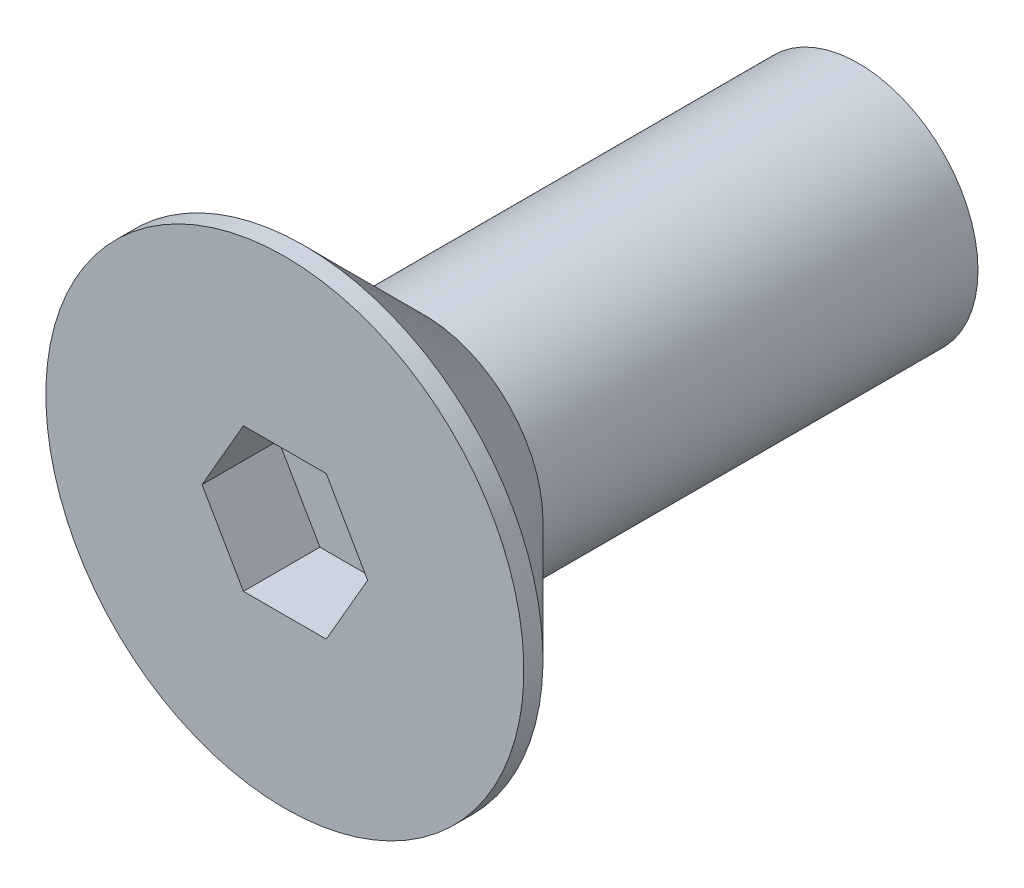
ISO-10303-21;
HEADER;
FILE_DESCRIPTION(('STEP AP214'),'2;1');
FILE_NAME('part.step','',(''),(''),'','','');
FILE_SCHEMA(('AUTOMOTIVE_DESIGN { 1 0 10303 214 1 1 1 1 }'));
ENDSEC;
DATA;
#1=APPLICATION_CONTEXT('core data for automotive mechanical design processes');
#2=APPLICATION_PROTOCOL_DEFINITION('international standard','automotive_design',2000,#1);
#3=PRODUCT_CONTEXT('',#1,'mechanical');
#4=PRODUCT('Part','Part','',(#3));
#5=PRODUCT_RELATED_PRODUCT_CATEGORY('part','',(#4));
#6=PRODUCT_DEFINITION_FORMATION('','',#4);
#7=PRODUCT_DEFINITION_CONTEXT('part definition',#1,'design');
#8=PRODUCT_DEFINITION('design','',#6,#7);
#9=PRODUCT_DEFINITION_SHAPE('','',#8);
#10=(LENGTH_UNIT() NAMED_UNIT(*) SI_UNIT(.MILLI.,.METRE.));
#11=(NAMED_UNIT(*) PLANE_ANGLE_UNIT() SI_UNIT($,.RADIAN.));
#12=(NAMED_UNIT(*) SI_UNIT($,.STERADIAN.) SOLID_ANGLE_UNIT());
#13=UNCERTAINTY_MEASURE_WITH_UNIT(LENGTH_MEASURE(1.E-05),#10,'distance_accuracy_value','');
#14=(GEOMETRIC_REPRESENTATION_CONTEXT(3) GLOBAL_UNCERTAINTY_ASSIGNED_CONTEXT((#13)) GLOBAL_UNIT_ASSIGNED_CONTEXT((#10,
#11,#12)) REPRESENTATION_CONTEXT('',''));
#15=CARTESIAN_POINT('',(0.,0.,0.));
#16=DIRECTION('',(0.,0.,1.));
#17=DIRECTION('',(1.,0.,0.));
#18=AXIS2_PLACEMENT_3D('',#15,#16,#17);
#19=CARTESIAN_POINT('',(-0.90932659804821,-0.787499942816793,-0.8));
#20=DIRECTION('',(0.,0.,-1.));
#21=DIRECTION('',(-1.,0.,0.));
#22=AXIS2_PLACEMENT_3D('',#19,#20,#21);
#23=PLANE('',#22);
#24=DIRECTION('',(-0.5,0.866025403784438,0.));
#25=VECTOR('',#24,1.);
#26=CARTESIAN_POINT('',(0.433012701892218,0.750000000000004,-0.8));
#27=LINE('',#26,#25);
#28=CARTESIAN_POINT('',(0.866025403784438,0.,-0.8));
#29=VERTEX_POINT('',#28);
#30=CARTESIAN_POINT('',(0.433012701892218,0.750000000000004,-0.8));
#31=VERTEX_POINT('',#30);
#32=EDGE_CURVE('E121',#29,#31,#27,.T.);
#33=ORIENTED_EDGE('',*,*,#32,.T.);
#34=DIRECTION('',(-1.,0.,0.));
#35=VECTOR('',#34,1.);
#36=CARTESIAN_POINT('',(-0.433012701892219,0.750000000000004,-0.8));
#37=LINE('',#36,#35);
#38=CARTESIAN_POINT('',(-0.433012701892219,0.750000000000004,-0.8));
#39=VERTEX_POINT('',#38);
#40=EDGE_CURVE('E126',#31,#39,#37,.T.);
#41=ORIENTED_EDGE('',*,*,#40,.T.);
#42=DIRECTION('',(-0.500000000000001,-0.866025403784438,0.));
#43=VECTOR('',#42,1.);
#44=CARTESIAN_POINT('',(-0.866025403784439,0.,-0.8));
#45=LINE('',#44,#43);
#46=CARTESIAN_POINT('',(-0.866025403784439,0.,-0.8));
#47=VERTEX_POINT('',#46);
#48=EDGE_CURVE('E130',#39,#47,#45,.T.);
#49=ORIENTED_EDGE('',*,*,#48,.T.);
#50=DIRECTION('',(0.500000000000001,-0.866025403784438,0.));
#51=VECTOR('',#50,1.);
#52=CARTESIAN_POINT('',(-0.43301270189222,-0.749999999999996,-0.8));
#53=LINE('',#52,#51);
#54=CARTESIAN_POINT('',(-0.43301270189222,-0.749999999999996,-0.8));
#55=VERTEX_POINT('',#54);
#56=EDGE_CURVE('E67',#47,#55,#53,.T.);
#57=ORIENTED_EDGE('',*,*,#56,.T.);
#58=DIRECTION('',(1.,0.,0.));
#59=VECTOR('',#58,1.);
#60=CARTESIAN_POINT('',(0.43301270189222,-0.749999999999996,-0.8));
#61=LINE('',#60,#59);
#62=CARTESIAN_POINT('',(0.43301270189222,-0.749999999999996,-0.8));
#63=VERTEX_POINT('',#62);
#64=EDGE_CURVE('E69',#55,#63,#61,.T.);
#65=ORIENTED_EDGE('',*,*,#64,.T.);
#66=DIRECTION('',(0.499999999999999,0.866025403784439,0.));
#67=VECTOR('',#66,1.);
#68=CARTESIAN_POINT('',(0.866025403784438,0.,-0.8));
#69=LINE('',#68,#67);
#70=EDGE_CURVE('E71',#63,#29,#69,.T.);
#71=ORIENTED_EDGE('',*,*,#70,.T.);
#72=EDGE_LOOP('',(#33,#41,#49,#57,#65,#71));
#73=FACE_BOUND('',#72,.T.);
#74=ADVANCED_FACE('F16',(#73),#23,.F.);
#75=CARTESIAN_POINT('',(0.866025403784438,0.,0.));
#76=DIRECTION('',(0.866025403784439,-0.499999999999999,0.));
#77=DIRECTION('',(0.499999999999999,0.866025403784439,0.));
#78=AXIS2_PLACEMENT_3D('',#75,#76,#77);
#79=PLANE('',#78);
#80=ORIENTED_EDGE('',*,*,#70,.F.);
#81=DIRECTION('',(0.,0.,1.));
#82=VECTOR('',#81,1.);
#83=CARTESIAN_POINT('',(0.43301270189222,-0.749999999999996,0.));
#84=LINE('',#83,#82);
#85=CARTESIAN_POINT('',(0.43301270189222,-0.749999999999996,0.));
#86=VERTEX_POINT('',#85);
#87=EDGE_CURVE('E76',#63,#86,#84,.T.);
#88=ORIENTED_EDGE('',*,*,#87,.T.);
#89=DIRECTION('',(-0.499999999999999,-0.866025403784439,0.));
#90=VECTOR('',#89,1.);
#91=CARTESIAN_POINT('',(0.866025403784438,0.,0.));
#92=LINE('',#91,#90);
#93=CARTESIAN_POINT('',(0.866025403784438,0.,0.));
#94=VERTEX_POINT('',#93);
#95=EDGE_CURVE('E118',#94,#86,#92,.T.);
#96=ORIENTED_EDGE('',*,*,#95,.F.);
#97=DIRECTION('',(0.,0.,1.));
#98=VECTOR('',#97,1.);
#99=CARTESIAN_POINT('',(0.866025403784438,0.,0.));
#100=LINE('',#99,#98);
#101=EDGE_CURVE('E82',#94,#29,#100,.F.);
#102=ORIENTED_EDGE('',*,*,#101,.T.);
#103=EDGE_LOOP('',(#80,#88,#96,#102));
#104=FACE_BOUND('',#103,.T.);
#105=ADVANCED_FACE('F79',(#104),#79,.F.);
#106=CARTESIAN_POINT('',(0.43301270189222,-0.749999999999996,0.));
#107=DIRECTION('',(0.,-1.,0.));
#108=DIRECTION('',(1.,0.,0.));
#109=AXIS2_PLACEMENT_3D('',#106,#107,#108);
#110=PLANE('',#109);
#111=ORIENTED_EDGE('',*,*,#64,.F.);
#112=DIRECTION('',(0.,0.,1.));
#113=VECTOR('',#112,1.);
#114=CARTESIAN_POINT('',(-0.43301270189222,-0.749999999999996,0.));
#115=LINE('',#114,#113);
#116=CARTESIAN_POINT('',(-0.43301270189222,-0.749999999999996,0.));
#117=VERTEX_POINT('',#116);
#118=EDGE_CURVE('E90',#55,#117,#115,.T.);
#119=ORIENTED_EDGE('',*,*,#118,.T.);
#120=DIRECTION('',(1.,0.,0.));
#121=VECTOR('',#120,1.);
#122=CARTESIAN_POINT('',(2.75,-0.749999999999996,0.));
#123=LINE('',#122,#121);
#124=EDGE_CURVE('E87',#86,#117,#123,.F.);
#125=ORIENTED_EDGE('',*,*,#124,.F.);
#126=ORIENTED_EDGE('',*,*,#87,.F.);
#127=EDGE_LOOP('',(#111,#119,#125,#126));
#128=FACE_BOUND('',#127,.T.);
#129=ADVANCED_FACE('F85',(#128),#110,.F.);
#130=CARTESIAN_POINT('',(-0.43301270189222,-0.749999999999996,0.));
#131=DIRECTION('',(-0.866025403784438,-0.500000000000001,0.));
#132=DIRECTION('',(0.500000000000001,-0.866025403784438,0.));
#133=AXIS2_PLACEMENT_3D('',#130,#131,#132);
#134=PLANE('',#133);
#135=ORIENTED_EDGE('',*,*,#56,.F.);
#136=DIRECTION('',(0.,0.,1.));
#137=VECTOR('',#136,1.);
#138=CARTESIAN_POINT('',(-0.866025403784439,0.,0.));
#139=LINE('',#138,#137);
#140=CARTESIAN_POINT('',(-0.866025403784439,0.,0.));
#141=VERTEX_POINT('',#140);
#142=EDGE_CURVE('E128',#47,#141,#139,.T.);
#143=ORIENTED_EDGE('',*,*,#142,.T.);
#144=DIRECTION('',(-0.5,0.866025403784438,0.));
#145=VECTOR('',#144,1.);
#146=CARTESIAN_POINT('',(-0.43301270189222,-0.749999999999996,0.));
#147=LINE('',#146,#145);
#148=EDGE_CURVE('E114',#117,#141,#147,.T.);
#149=ORIENTED_EDGE('',*,*,#148,.F.);
#150=ORIENTED_EDGE('',*,*,#118,.F.);
#151=EDGE_LOOP('',(#135,#143,#149,#150));
#152=FACE_BOUND('',#151,.T.);
#153=ADVANCED_FACE('F133',(#152),#134,.F.);
#154=CARTESIAN_POINT('',(-0.866025403784439,0.,0.));
#155=DIRECTION('',(-0.866025403784438,0.500000000000001,0.));
#156=DIRECTION('',(-0.500000000000001,-0.866025403784438,0.));
#157=AXIS2_PLACEMENT_3D('',#154,#155,#156);
#158=PLANE('',#157);
#159=ORIENTED_EDGE('',*,*,#48,.F.);
#160=DIRECTION('',(0.,0.,1.));
#161=VECTOR('',#160,1.);
#162=CARTESIAN_POINT('',(-0.433012701892219,0.750000000000004,0.));
#163=LINE('',#162,#161);
#164=CARTESIAN_POINT('',(-0.433012701892219,0.750000000000004,0.));
#165=VERTEX_POINT('',#164);
#166=EDGE_CURVE('E124',#39,#165,#163,.T.);
#167=ORIENTED_EDGE('',*,*,#166,.T.);
#168=DIRECTION('',(0.5,0.866025403784439,0.));
#169=VECTOR('',#168,1.);
#170=CARTESIAN_POINT('',(-0.866025403784439,0.,0.));
#171=LINE('',#170,#169);
#172=EDGE_CURVE('E111',#141,#165,#171,.T.);
#173=ORIENTED_EDGE('',*,*,#172,.F.);
#174=ORIENTED_EDGE('',*,*,#142,.F.);
#175=EDGE_LOOP('',(#159,#167,#173,#174));
#176=FACE_BOUND('',#175,.T.);
#177=ADVANCED_FACE('F144',(#176),#158,.F.);
#178=CARTESIAN_POINT('',(-0.433012701892219,0.750000000000004,0.));
#179=DIRECTION('',(0.,1.,0.));
#180=DIRECTION('',(-1.,0.,0.));
#181=AXIS2_PLACEMENT_3D('',#178,#179,#180);
#182=PLANE('',#181);
#183=ORIENTED_EDGE('',*,*,#40,.F.);
#184=DIRECTION('',(0.,0.,1.));
#185=VECTOR('',#184,1.);
#186=CARTESIAN_POINT('',(0.433012701892218,0.750000000000004,0.));
#187=LINE('',#186,#185);
#188=CARTESIAN_POINT('',(0.433012701892218,0.750000000000004,0.));
#189=VERTEX_POINT('',#188);
#190=EDGE_CURVE('E34',#31,#189,#187,.T.);
#191=ORIENTED_EDGE('',*,*,#190,.T.);
#192=DIRECTION('',(1.,0.,0.));
#193=VECTOR('',#192,1.);
#194=CARTESIAN_POINT('',(2.75,0.750000000000004,0.));
#195=LINE('',#194,#193);
#196=EDGE_CURVE('E108',#165,#189,#195,.T.);
#197=ORIENTED_EDGE('',*,*,#196,.F.);
#198=ORIENTED_EDGE('',*,*,#166,.F.);
#199=EDGE_LOOP('',(#183,#191,#197,#198));
#200=FACE_BOUND('',#199,.T.);
#201=ADVANCED_FACE('F142',(#200),#182,.F.);
#202=CARTESIAN_POINT('',(0.433012701892218,0.750000000000004,0.));
#203=DIRECTION('',(0.866025403784438,0.5,0.));
#204=DIRECTION('',(-0.5,0.866025403784438,0.));
#205=AXIS2_PLACEMENT_3D('',#202,#203,#204);
#206=PLANE('',#205);
#207=ORIENTED_EDGE('',*,*,#32,.F.);
#208=ORIENTED_EDGE('',*,*,#101,.F.);
#209=DIRECTION('',(0.500000000000001,-0.866025403784438,0.));
#210=VECTOR('',#209,1.);
#211=CARTESIAN_POINT('',(0.433012701892218,0.750000000000004,0.));
#212=LINE('',#211,#210);
#213=EDGE_CURVE('E102',#189,#94,#212,.T.);
#214=ORIENTED_EDGE('',*,*,#213,.F.);
#215=ORIENTED_EDGE('',*,*,#190,.F.);
#216=EDGE_LOOP('',(#207,#208,#214,#215));
#217=FACE_BOUND('',#216,.T.);
#218=ADVANCED_FACE('F139',(#217),#206,.F.);
#219=CARTESIAN_POINT('',(2.75,-2.75,0.));
#220=DIRECTION('',(0.,0.,1.));
#221=DIRECTION('',(1.,0.,0.));
#222=AXIS2_PLACEMENT_3D('',#219,#220,#221);
#223=PLANE('',#222);
#224=CARTESIAN_POINT('',(0.,0.,0.));
#225=DIRECTION('',(0.,0.,-1.));
#226=DIRECTION('',(0.,1.,0.));
#227=AXIS2_PLACEMENT_3D('',#224,#225,#226);
#228=CIRCLE('',#227,2.5);
#229=CARTESIAN_POINT('',(0.,2.5,0.));
#230=VERTEX_POINT('',#229);
#231=EDGE_CURVE('E19',#230,#230,#228,.T.);
#232=ORIENTED_EDGE('',*,*,#231,.F.);
#233=EDGE_LOOP('',(#232));
#234=FACE_BOUND('',#233,.T.);
#235=ORIENTED_EDGE('',*,*,#196,.T.);
#236=ORIENTED_EDGE('',*,*,#213,.T.);
#237=ORIENTED_EDGE('',*,*,#95,.T.);
#238=ORIENTED_EDGE('',*,*,#124,.T.);
#239=ORIENTED_EDGE('',*,*,#148,.T.);
#240=ORIENTED_EDGE('',*,*,#172,.T.);
#241=EDGE_LOOP('',(#235,#236,#237,#238,#239,#240));
#242=FACE_BOUND('',#241,.T.);
#243=ADVANCED_FACE('F137',(#234,#242),#223,.T.);
#244=CARTESIAN_POINT('',(0.,0.,0.));
#245=DIRECTION('',(0.,0.,-1.));
#246=DIRECTION('',(0.,1.,0.));
#247=AXIS2_PLACEMENT_3D('',#244,#245,#246);
#248=CYLINDRICAL_SURFACE('',#247,2.5);
#249=ORIENTED_EDGE('',*,*,#231,.T.);
#250=EDGE_LOOP('',(#249));
#251=FACE_BOUND('',#250,.T.);
#252=CARTESIAN_POINT('',(0.,0.,-0.199999998869771));
#253=DIRECTION('',(0.,0.,1.));
#254=DIRECTION('',(-1.,0.,0.));
#255=AXIS2_PLACEMENT_3D('',#252,#253,#254);
#256=CIRCLE('',#255,2.49999999886086);
#257=CARTESIAN_POINT('',(-2.49999999886086,0.,-0.199999998869771));
#258=VERTEX_POINT('',#257);
#259=EDGE_CURVE('E94',#258,#258,#256,.F.);
#260=ORIENTED_EDGE('',*,*,#259,.F.);
#261=EDGE_LOOP('',(#260));
#262=FACE_BOUND('',#261,.T.);
#263=ADVANCED_FACE('F167',(#251,#262),#248,.T.);
#264=CARTESIAN_POINT('',(-1.31249986588955,1.31249986588955,-6.));
#265=DIRECTION('',(0.,0.,-1.));
#266=DIRECTION('',(-1.,0.,0.));
#267=AXIS2_PLACEMENT_3D('',#264,#265,#266);
#268=PLANE('',#267);
#269=CARTESIAN_POINT('',(0.,0.,-6.));
#270=DIRECTION('',(0.,0.,-1.));
#271=DIRECTION('',(-1.,0.,0.));
#272=AXIS2_PLACEMENT_3D('',#269,#270,#271);
#273=CIRCLE('',#272,1.25);
#274=CARTESIAN_POINT('',(-1.25,0.,-6.));
#275=VERTEX_POINT('',#274);
#276=EDGE_CURVE('E25',#275,#275,#273,.F.);
#277=ORIENTED_EDGE('',*,*,#276,.F.);
#278=EDGE_LOOP('',(#277));
#279=FACE_BOUND('',#278,.T.);
#280=ADVANCED_FACE('F162',(#279),#268,.T.);
#281=CARTESIAN_POINT('',(0.,0.,-0.199999998983458));
#282=DIRECTION('',(0.,0.,1.));
#283=DIRECTION('',(1.,0.,0.));
#284=AXIS2_PLACEMENT_3D('',#281,#282,#283);
#285=CONICAL_SURFACE('',#284,2.49999999880401,0.785398162510691);
#286=ORIENTED_EDGE('',*,*,#259,.T.);
#287=EDGE_LOOP('',(#286));
#288=FACE_BOUND('',#287,.T.);
#289=CARTESIAN_POINT('',(0.,0.,-1.45));
#290=DIRECTION('',(0.,0.,-1.));
#291=DIRECTION('',(-1.,0.,0.));
#292=AXIS2_PLACEMENT_3D('',#289,#290,#291);
#293=CIRCLE('',#292,1.25);
#294=CARTESIAN_POINT('',(-1.25,0.,-1.45));
#295=VERTEX_POINT('',#294);
#296=EDGE_CURVE('E11',#295,#295,#293,.T.);
#297=ORIENTED_EDGE('',*,*,#296,.F.);
#298=EDGE_LOOP('',(#297));
#299=FACE_BOUND('',#298,.T.);
#300=ADVANCED_FACE('F156',(#288,#299),#285,.T.);
#301=CARTESIAN_POINT('',(0.,0.,-1.45));
#302=DIRECTION('',(0.,0.,-1.));
#303=DIRECTION('',(-1.,0.,0.));
#304=AXIS2_PLACEMENT_3D('',#301,#302,#303);
#305=CYLINDRICAL_SURFACE('',#304,1.25);
#306=ORIENTED_EDGE('',*,*,#296,.T.);
#307=EDGE_LOOP('',(#306));
#308=FACE_BOUND('',#307,.T.);
#309=ORIENTED_EDGE('',*,*,#276,.T.);
#310=EDGE_LOOP('',(#309));
#311=FACE_BOUND('',#310,.T.);
#312=ADVANCED_FACE('F154',(#308,#311),#305,.T.);
#313=CLOSED_SHELL('',(#74,#105,#129,#153,#177,#201,#218,#243,#263,#280,#300,#312));
#314=MANIFOLD_SOLID_BREP('B1',#313);
#315=ADVANCED_BREP_SHAPE_REPRESENTATION('',(#18,#314),#14);
#316=SHAPE_DEFINITION_REPRESENTATION(#9,#315);
ENDSEC;
END-ISO-10303-21;
